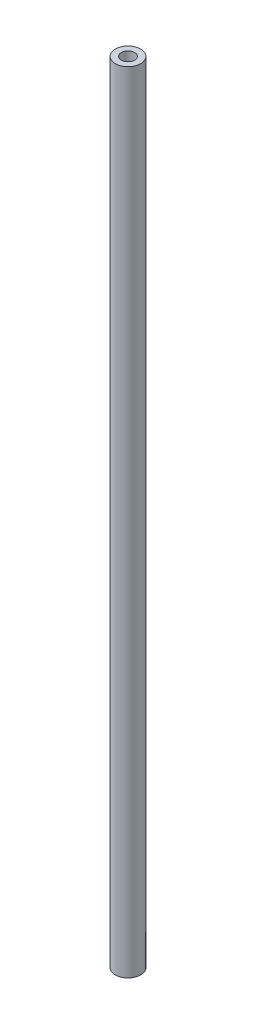
ISO-10303-21;
HEADER;
FILE_DESCRIPTION(('STEP AP214'),'2;1');
FILE_NAME('part.step','',(''),(''),'','','');
FILE_SCHEMA(('AUTOMOTIVE_DESIGN { 1 0 10303 214 1 1 1 1 }'));
ENDSEC;
DATA;
#1=APPLICATION_CONTEXT('core data for automotive mechanical design processes');
#2=APPLICATION_PROTOCOL_DEFINITION('international standard','automotive_design',2000,#1);
#3=PRODUCT_CONTEXT('',#1,'mechanical');
#4=PRODUCT('Part','Part','',(#3));
#5=PRODUCT_RELATED_PRODUCT_CATEGORY('part','',(#4));
#6=PRODUCT_DEFINITION_FORMATION('','',#4);
#7=PRODUCT_DEFINITION_CONTEXT('part definition',#1,'design');
#8=PRODUCT_DEFINITION('design','',#6,#7);
#9=PRODUCT_DEFINITION_SHAPE('','',#8);
#10=(LENGTH_UNIT() NAMED_UNIT(*) SI_UNIT(.MILLI.,.METRE.));
#11=(NAMED_UNIT(*) PLANE_ANGLE_UNIT() SI_UNIT($,.RADIAN.));
#12=(NAMED_UNIT(*) SI_UNIT($,.STERADIAN.) SOLID_ANGLE_UNIT());
#13=UNCERTAINTY_MEASURE_WITH_UNIT(LENGTH_MEASURE(1.E-05),#10,'distance_accuracy_value','');
#14=(GEOMETRIC_REPRESENTATION_CONTEXT(3) GLOBAL_UNCERTAINTY_ASSIGNED_CONTEXT((#13)) GLOBAL_UNIT_ASSIGNED_CONTEXT((#10,
#11,#12)) REPRESENTATION_CONTEXT('',''));
#15=CARTESIAN_POINT('',(0.,0.,0.));
#16=DIRECTION('',(0.,0.,1.));
#17=DIRECTION('',(1.,0.,0.));
#18=AXIS2_PLACEMENT_3D('',#15,#16,#17);
#19=CARTESIAN_POINT('',(0.,20.,0.));
#20=DIRECTION('',(0.,1.,0.));
#21=DIRECTION('',(0.,0.,1.));
#22=AXIS2_PLACEMENT_3D('',#19,#20,#21);
#23=PLANE('',#22);
#24=CARTESIAN_POINT('',(0.,20.,0.));
#25=DIRECTION('',(0.,1.,0.));
#26=DIRECTION('',(0.,0.,1.));
#27=AXIS2_PLACEMENT_3D('',#24,#25,#26);
#28=CIRCLE('',#27,0.3207);
#29=CARTESIAN_POINT('',(0.,20.,0.3207));
#30=VERTEX_POINT('',#29);
#31=EDGE_CURVE('E10',#30,#30,#28,.T.);
#32=ORIENTED_EDGE('',*,*,#31,.T.);
#33=EDGE_LOOP('',(#32));
#34=FACE_BOUND('',#33,.T.);
#35=CARTESIAN_POINT('',(0.,20.,0.));
#36=DIRECTION('',(0.,1.,0.));
#37=DIRECTION('',(0.,0.,1.));
#38=AXIS2_PLACEMENT_3D('',#35,#36,#37);
#39=CIRCLE('',#38,0.1685);
#40=CARTESIAN_POINT('',(0.,20.,0.1685));
#41=VERTEX_POINT('',#40);
#42=EDGE_CURVE('E41',#41,#41,#39,.T.);
#43=ORIENTED_EDGE('',*,*,#42,.F.);
#44=EDGE_LOOP('',(#43));
#45=FACE_BOUND('',#44,.T.);
#46=ADVANCED_FACE('F30',(#34,#45),#23,.T.);
#47=CARTESIAN_POINT('',(0.,0.,0.));
#48=DIRECTION('',(0.,1.,0.));
#49=DIRECTION('',(0.,0.,1.));
#50=AXIS2_PLACEMENT_3D('',#47,#48,#49);
#51=PLANE('',#50);
#52=CARTESIAN_POINT('',(0.,0.,0.));
#53=DIRECTION('',(0.,1.,0.));
#54=DIRECTION('',(0.,0.,1.));
#55=AXIS2_PLACEMENT_3D('',#52,#53,#54);
#56=CIRCLE('',#55,0.3207);
#57=CARTESIAN_POINT('',(0.,0.,0.3207));
#58=VERTEX_POINT('',#57);
#59=EDGE_CURVE('E34',#58,#58,#56,.T.);
#60=ORIENTED_EDGE('',*,*,#59,.F.);
#61=EDGE_LOOP('',(#60));
#62=FACE_BOUND('',#61,.T.);
#63=CARTESIAN_POINT('',(0.,0.,0.));
#64=DIRECTION('',(0.,1.,0.));
#65=DIRECTION('',(0.,0.,1.));
#66=AXIS2_PLACEMENT_3D('',#63,#64,#65);
#67=CIRCLE('',#66,0.1685);
#68=CARTESIAN_POINT('',(0.,0.,0.1685));
#69=VERTEX_POINT('',#68);
#70=EDGE_CURVE('E43',#69,#69,#67,.T.);
#71=ORIENTED_EDGE('',*,*,#70,.T.);
#72=EDGE_LOOP('',(#71));
#73=FACE_BOUND('',#72,.T.);
#74=ADVANCED_FACE('F53',(#62,#73),#51,.F.);
#75=CARTESIAN_POINT('',(0.,20.,0.));
#76=DIRECTION('',(0.,-1.,0.));
#77=DIRECTION('',(0.,0.,-1.));
#78=AXIS2_PLACEMENT_3D('',#75,#76,#77);
#79=CYLINDRICAL_SURFACE('',#78,0.3207);
#80=ORIENTED_EDGE('',*,*,#31,.F.);
#81=EDGE_LOOP('',(#80));
#82=FACE_BOUND('',#81,.T.);
#83=ORIENTED_EDGE('',*,*,#59,.T.);
#84=EDGE_LOOP('',(#83));
#85=FACE_BOUND('',#84,.T.);
#86=ADVANCED_FACE('F32',(#82,#85),#79,.T.);
#87=CARTESIAN_POINT('',(0.,20.,0.));
#88=DIRECTION('',(0.,-1.,0.));
#89=DIRECTION('',(0.,0.,-1.));
#90=AXIS2_PLACEMENT_3D('',#87,#88,#89);
#91=CYLINDRICAL_SURFACE('',#90,0.1685);
#92=ORIENTED_EDGE('',*,*,#42,.T.);
#93=EDGE_LOOP('',(#92));
#94=FACE_BOUND('',#93,.T.);
#95=ORIENTED_EDGE('',*,*,#70,.F.);
#96=EDGE_LOOP('',(#95));
#97=FACE_BOUND('',#96,.T.);
#98=ADVANCED_FACE('F49',(#94,#97),#91,.F.);
#99=CLOSED_SHELL('',(#46,#74,#86,#98));
#100=MANIFOLD_SOLID_BREP('B2',#99);
#101=ADVANCED_BREP_SHAPE_REPRESENTATION('',(#18,#100),#14);
#102=SHAPE_DEFINITION_REPRESENTATION(#9,#101);
ENDSEC;
END-ISO-10303-21;
